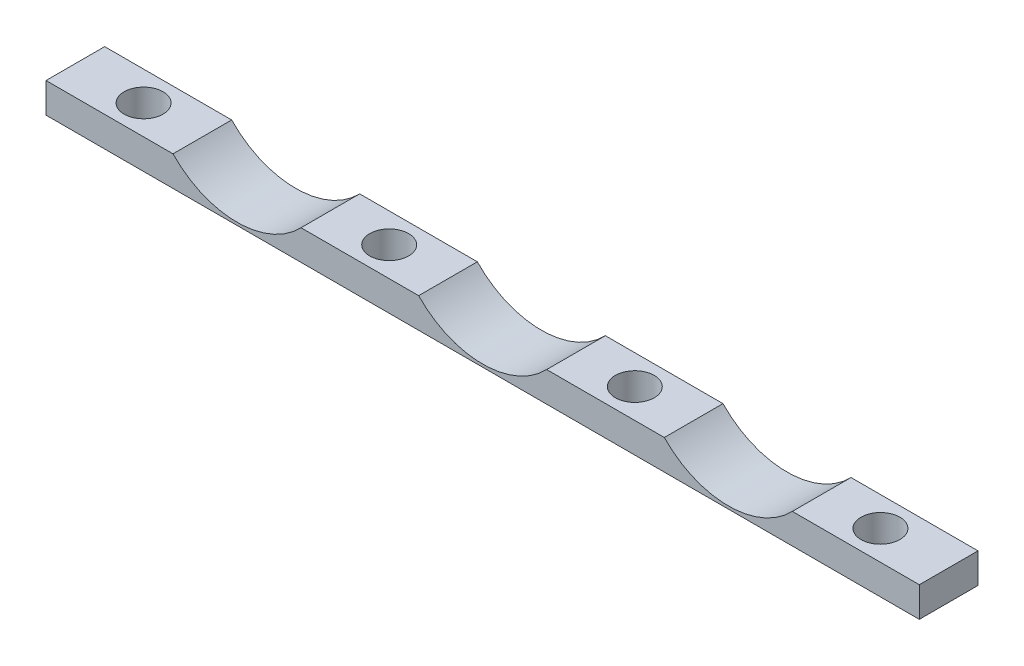
ISO-10303-21;
HEADER;
FILE_DESCRIPTION(('STEP AP214'),'2;1');
FILE_NAME('part.step','',(''),(''),'','','');
FILE_SCHEMA(('AUTOMOTIVE_DESIGN { 1 0 10303 214 1 1 1 1 }'));
ENDSEC;
DATA;
#1=APPLICATION_CONTEXT('core data for automotive mechanical design processes');
#2=APPLICATION_PROTOCOL_DEFINITION('international standard','automotive_design',2000,#1);
#3=PRODUCT_CONTEXT('',#1,'mechanical');
#4=PRODUCT('Part','Part','',(#3));
#5=PRODUCT_RELATED_PRODUCT_CATEGORY('part','',(#4));
#6=PRODUCT_DEFINITION_FORMATION('','',#4);
#7=PRODUCT_DEFINITION_CONTEXT('part definition',#1,'design');
#8=PRODUCT_DEFINITION('design','',#6,#7);
#9=PRODUCT_DEFINITION_SHAPE('','',#8);
#10=(LENGTH_UNIT() NAMED_UNIT(*) SI_UNIT(.MILLI.,.METRE.));
#11=(NAMED_UNIT(*) PLANE_ANGLE_UNIT() SI_UNIT($,.RADIAN.));
#12=(NAMED_UNIT(*) SI_UNIT($,.STERADIAN.) SOLID_ANGLE_UNIT());
#13=UNCERTAINTY_MEASURE_WITH_UNIT(LENGTH_MEASURE(1.E-05),#10,'distance_accuracy_value','');
#14=(GEOMETRIC_REPRESENTATION_CONTEXT(3) GLOBAL_UNCERTAINTY_ASSIGNED_CONTEXT((#13)) GLOBAL_UNIT_ASSIGNED_CONTEXT((#10,
#11,#12)) REPRESENTATION_CONTEXT('',''));
#15=CARTESIAN_POINT('',(0.,0.,0.));
#16=DIRECTION('',(0.,0.,1.));
#17=DIRECTION('',(1.,0.,0.));
#18=AXIS2_PLACEMENT_3D('',#15,#16,#17);
#19=CARTESIAN_POINT('',(-18.0027546578401,-6.,4.3));
#20=DIRECTION('',(0.,0.,-1.));
#21=DIRECTION('',(-1.,0.,0.));
#22=AXIS2_PLACEMENT_3D('',#19,#20,#21);
#23=CYLINDRICAL_SURFACE('',#22,6.5);
#24=CARTESIAN_POINT('',(-18.0027546578401,-6.,0.));
#25=DIRECTION('',(0.,0.,-1.));
#26=DIRECTION('',(1.,0.,0.));
#27=AXIS2_PLACEMENT_3D('',#24,#25,#26);
#28=CIRCLE('',#27,6.5);
#29=CARTESIAN_POINT('',(-13.3123388980167,-10.5,0.));
#30=VERTEX_POINT('',#29);
#31=CARTESIAN_POINT('',(-22.6931704176636,-10.5,0.));
#32=VERTEX_POINT('',#31);
#33=EDGE_CURVE('E144',#30,#32,#28,.T.);
#34=ORIENTED_EDGE('',*,*,#33,.T.);
#35=DIRECTION('',(0.,0.,-1.));
#36=VECTOR('',#35,1.);
#37=CARTESIAN_POINT('',(-22.6931704176636,-10.5,4.3));
#38=LINE('',#37,#36);
#39=CARTESIAN_POINT('',(-22.6931704176636,-10.5,4.3));
#40=VERTEX_POINT('',#39);
#41=EDGE_CURVE('E11',#40,#32,#38,.T.);
#42=ORIENTED_EDGE('',*,*,#41,.F.);
#43=CARTESIAN_POINT('',(-18.0027546578401,-6.,4.3));
#44=DIRECTION('',(0.,0.,-1.));
#45=DIRECTION('',(1.,0.,0.));
#46=AXIS2_PLACEMENT_3D('',#43,#44,#45);
#47=CIRCLE('',#46,6.5);
#48=CARTESIAN_POINT('',(-13.3123388980167,-10.5,4.3));
#49=VERTEX_POINT('',#48);
#50=EDGE_CURVE('E163',#49,#40,#47,.T.);
#51=ORIENTED_EDGE('',*,*,#50,.F.);
#52=DIRECTION('',(0.,0.,-1.));
#53=VECTOR('',#52,1.);
#54=CARTESIAN_POINT('',(-13.3123388980167,-10.5,4.3));
#55=LINE('',#54,#53);
#56=EDGE_CURVE('E140',#49,#30,#55,.T.);
#57=ORIENTED_EDGE('',*,*,#56,.T.);
#58=EDGE_LOOP('',(#34,#42,#51,#57));
#59=FACE_BOUND('',#58,.T.);
#60=ADVANCED_FACE('F36',(#59),#23,.F.);
#61=CARTESIAN_POINT('',(-22.6931704176636,-10.5,4.3));
#62=DIRECTION('',(0.,-1.,0.));
#63=DIRECTION('',(1.,0.,0.));
#64=AXIS2_PLACEMENT_3D('',#61,#62,#63);
#65=PLANE('',#64);
#66=CARTESIAN_POINT('',(-27.,-10.5,2.15));
#67=DIRECTION('',(0.,1.,0.));
#68=DIRECTION('',(-1.,0.,0.));
#69=AXIS2_PLACEMENT_3D('',#66,#67,#68);
#70=CIRCLE('',#69,1.425);
#71=CARTESIAN_POINT('',(-28.425,-10.5,2.15));
#72=VERTEX_POINT('',#71);
#73=EDGE_CURVE('E222',#72,#72,#70,.T.);
#74=ORIENTED_EDGE('',*,*,#73,.F.);
#75=EDGE_LOOP('',(#74));
#76=FACE_BOUND('',#75,.T.);
#77=DIRECTION('',(-1.,0.,0.));
#78=VECTOR('',#77,1.);
#79=CARTESIAN_POINT('',(-22.6931704176636,-10.5,0.));
#80=LINE('',#79,#78);
#81=CARTESIAN_POINT('',(-32.,-10.5,0.));
#82=VERTEX_POINT('',#81);
#83=EDGE_CURVE('E147',#32,#82,#80,.T.);
#84=ORIENTED_EDGE('',*,*,#83,.T.);
#85=DIRECTION('',(0.,0.,-1.));
#86=VECTOR('',#85,1.);
#87=CARTESIAN_POINT('',(-32.,-10.5,4.3));
#88=LINE('',#87,#86);
#89=CARTESIAN_POINT('',(-32.,-10.5,4.3));
#90=VERTEX_POINT('',#89);
#91=EDGE_CURVE('E44',#90,#82,#88,.T.);
#92=ORIENTED_EDGE('',*,*,#91,.F.);
#93=DIRECTION('',(-1.,0.,0.));
#94=VECTOR('',#93,1.);
#95=CARTESIAN_POINT('',(-22.6931704176636,-10.5,4.3));
#96=LINE('',#95,#94);
#97=EDGE_CURVE('E101',#40,#90,#96,.T.);
#98=ORIENTED_EDGE('',*,*,#97,.F.);
#99=ORIENTED_EDGE('',*,*,#41,.T.);
#100=EDGE_LOOP('',(#84,#92,#98,#99));
#101=FACE_BOUND('',#100,.T.);
#102=ADVANCED_FACE('F257',(#76,#101),#65,.F.);
#103=CARTESIAN_POINT('',(-32.,-10.5,4.3));
#104=DIRECTION('',(1.,0.,0.));
#105=DIRECTION('',(0.,0.,-1.));
#106=AXIS2_PLACEMENT_3D('',#103,#104,#105);
#107=PLANE('',#106);
#108=DIRECTION('',(0.,-1.,0.));
#109=VECTOR('',#108,1.);
#110=CARTESIAN_POINT('',(-32.,-10.5,0.));
#111=LINE('',#110,#109);
#112=CARTESIAN_POINT('',(-32.,-12.7,0.));
#113=VERTEX_POINT('',#112);
#114=EDGE_CURVE('E150',#82,#113,#111,.T.);
#115=ORIENTED_EDGE('',*,*,#114,.T.);
#116=DIRECTION('',(0.,0.,-1.));
#117=VECTOR('',#116,1.);
#118=CARTESIAN_POINT('',(-32.,-12.7,4.3));
#119=LINE('',#118,#117);
#120=CARTESIAN_POINT('',(-32.,-12.7,4.3));
#121=VERTEX_POINT('',#120);
#122=EDGE_CURVE('E176',#121,#113,#119,.T.);
#123=ORIENTED_EDGE('',*,*,#122,.F.);
#124=DIRECTION('',(0.,-1.,0.));
#125=VECTOR('',#124,1.);
#126=CARTESIAN_POINT('',(-32.,-10.5,4.3));
#127=LINE('',#126,#125);
#128=EDGE_CURVE('E184',#90,#121,#127,.T.);
#129=ORIENTED_EDGE('',*,*,#128,.F.);
#130=ORIENTED_EDGE('',*,*,#91,.T.);
#131=EDGE_LOOP('',(#115,#123,#129,#130));
#132=FACE_BOUND('',#131,.T.);
#133=ADVANCED_FACE('F182',(#132),#107,.F.);
#134=CARTESIAN_POINT('',(-32.,-12.7,4.3));
#135=DIRECTION('',(0.,1.,0.));
#136=DIRECTION('',(0.,0.,1.));
#137=AXIS2_PLACEMENT_3D('',#134,#135,#136);
#138=PLANE('',#137);
#139=CARTESIAN_POINT('',(27.,-12.7,2.15));
#140=DIRECTION('',(0.,1.,0.));
#141=DIRECTION('',(-1.,0.,0.));
#142=AXIS2_PLACEMENT_3D('',#139,#140,#141);
#143=CIRCLE('',#142,1.425);
#144=CARTESIAN_POINT('',(25.575,-12.7,2.15));
#145=VERTEX_POINT('',#144);
#146=EDGE_CURVE('E219',#145,#145,#143,.T.);
#147=ORIENTED_EDGE('',*,*,#146,.T.);
#148=EDGE_LOOP('',(#147));
#149=FACE_BOUND('',#148,.T.);
#150=CARTESIAN_POINT('',(-27.,-12.7,2.15));
#151=DIRECTION('',(0.,1.,0.));
#152=DIRECTION('',(-1.,0.,0.));
#153=AXIS2_PLACEMENT_3D('',#150,#151,#152);
#154=CIRCLE('',#153,1.425);
#155=CARTESIAN_POINT('',(-28.425,-12.7,2.15));
#156=VERTEX_POINT('',#155);
#157=EDGE_CURVE('E225',#156,#156,#154,.T.);
#158=ORIENTED_EDGE('',*,*,#157,.T.);
#159=EDGE_LOOP('',(#158));
#160=FACE_BOUND('',#159,.T.);
#161=CARTESIAN_POINT('',(9.,-12.7,2.15));
#162=DIRECTION('',(0.,1.,0.));
#163=DIRECTION('',(-1.,0.,0.));
#164=AXIS2_PLACEMENT_3D('',#161,#162,#163);
#165=CIRCLE('',#164,1.425);
#166=CARTESIAN_POINT('',(7.575,-12.7,2.15));
#167=VERTEX_POINT('',#166);
#168=EDGE_CURVE('E213',#167,#167,#165,.T.);
#169=ORIENTED_EDGE('',*,*,#168,.T.);
#170=EDGE_LOOP('',(#169));
#171=FACE_BOUND('',#170,.T.);
#172=CARTESIAN_POINT('',(-9.,-12.7,2.15));
#173=DIRECTION('',(0.,1.,0.));
#174=DIRECTION('',(-1.,0.,0.));
#175=AXIS2_PLACEMENT_3D('',#172,#173,#174);
#176=CIRCLE('',#175,1.425);
#177=CARTESIAN_POINT('',(-10.425,-12.7,2.15));
#178=VERTEX_POINT('',#177);
#179=EDGE_CURVE('E148',#178,#178,#176,.T.);
#180=ORIENTED_EDGE('',*,*,#179,.T.);
#181=EDGE_LOOP('',(#180));
#182=FACE_BOUND('',#181,.T.);
#183=DIRECTION('',(1.,0.,0.));
#184=VECTOR('',#183,1.);
#185=CARTESIAN_POINT('',(-32.,-12.7,0.));
#186=LINE('',#185,#184);
#187=CARTESIAN_POINT('',(32.,-12.7,0.));
#188=VERTEX_POINT('',#187);
#189=EDGE_CURVE('E152',#113,#188,#186,.T.);
#190=ORIENTED_EDGE('',*,*,#189,.T.);
#191=DIRECTION('',(0.,0.,-1.));
#192=VECTOR('',#191,1.);
#193=CARTESIAN_POINT('',(32.,-12.7,4.3));
#194=LINE('',#193,#192);
#195=CARTESIAN_POINT('',(32.,-12.7,4.3));
#196=VERTEX_POINT('',#195);
#197=EDGE_CURVE('E173',#196,#188,#194,.T.);
#198=ORIENTED_EDGE('',*,*,#197,.F.);
#199=DIRECTION('',(1.,0.,0.));
#200=VECTOR('',#199,1.);
#201=CARTESIAN_POINT('',(-32.,-12.7,4.3));
#202=LINE('',#201,#200);
#203=EDGE_CURVE('E202',#121,#196,#202,.T.);
#204=ORIENTED_EDGE('',*,*,#203,.F.);
#205=ORIENTED_EDGE('',*,*,#122,.T.);
#206=EDGE_LOOP('',(#190,#198,#204,#205));
#207=FACE_BOUND('',#206,.T.);
#208=ADVANCED_FACE('F193',(#149,#160,#171,#182,#207),#138,.F.);
#209=CARTESIAN_POINT('',(32.,-10.5,4.3));
#210=DIRECTION('',(-1.,0.,0.));
#211=DIRECTION('',(0.,0.,1.));
#212=AXIS2_PLACEMENT_3D('',#209,#210,#211);
#213=PLANE('',#212);
#214=DIRECTION('',(0.,1.,0.));
#215=VECTOR('',#214,1.);
#216=CARTESIAN_POINT('',(32.,-10.5,0.));
#217=LINE('',#216,#215);
#218=CARTESIAN_POINT('',(32.,-10.5,0.));
#219=VERTEX_POINT('',#218);
#220=EDGE_CURVE('E154',#188,#219,#217,.T.);
#221=ORIENTED_EDGE('',*,*,#220,.T.);
#222=DIRECTION('',(0.,0.,-1.));
#223=VECTOR('',#222,1.);
#224=CARTESIAN_POINT('',(32.,-10.5,4.3));
#225=LINE('',#224,#223);
#226=CARTESIAN_POINT('',(32.,-10.5,4.3));
#227=VERTEX_POINT('',#226);
#228=EDGE_CURVE('E170',#227,#219,#225,.T.);
#229=ORIENTED_EDGE('',*,*,#228,.F.);
#230=DIRECTION('',(0.,1.,0.));
#231=VECTOR('',#230,1.);
#232=CARTESIAN_POINT('',(32.,-10.5,4.3));
#233=LINE('',#232,#231);
#234=EDGE_CURVE('E199',#196,#227,#233,.T.);
#235=ORIENTED_EDGE('',*,*,#234,.F.);
#236=ORIENTED_EDGE('',*,*,#197,.T.);
#237=EDGE_LOOP('',(#221,#229,#235,#236));
#238=FACE_BOUND('',#237,.T.);
#239=ADVANCED_FACE('F197',(#238),#213,.F.);
#240=CARTESIAN_POINT('',(22.6931704176636,-10.5,4.3));
#241=DIRECTION('',(0.,-1.,0.));
#242=DIRECTION('',(0.,0.,-1.));
#243=AXIS2_PLACEMENT_3D('',#240,#241,#242);
#244=PLANE('',#243);
#245=CARTESIAN_POINT('',(27.,-10.5,2.15));
#246=DIRECTION('',(0.,1.,0.));
#247=DIRECTION('',(-1.,0.,0.));
#248=AXIS2_PLACEMENT_3D('',#245,#246,#247);
#249=CIRCLE('',#248,1.425);
#250=CARTESIAN_POINT('',(25.575,-10.5,2.15));
#251=VERTEX_POINT('',#250);
#252=EDGE_CURVE('E216',#251,#251,#249,.T.);
#253=ORIENTED_EDGE('',*,*,#252,.F.);
#254=EDGE_LOOP('',(#253));
#255=FACE_BOUND('',#254,.T.);
#256=DIRECTION('',(-1.,0.,0.));
#257=VECTOR('',#256,1.);
#258=CARTESIAN_POINT('',(22.6931704176636,-10.5,0.));
#259=LINE('',#258,#257);
#260=CARTESIAN_POINT('',(22.6931704176635,-10.5,0.));
#261=VERTEX_POINT('',#260);
#262=EDGE_CURVE('E156',#219,#261,#259,.T.);
#263=ORIENTED_EDGE('',*,*,#262,.T.);
#264=DIRECTION('',(0.,0.,-1.));
#265=VECTOR('',#264,1.);
#266=CARTESIAN_POINT('',(22.6931704176635,-10.5,4.3));
#267=LINE('',#266,#265);
#268=CARTESIAN_POINT('',(22.6931704176635,-10.5,4.3));
#269=VERTEX_POINT('',#268);
#270=EDGE_CURVE('E167',#269,#261,#267,.T.);
#271=ORIENTED_EDGE('',*,*,#270,.F.);
#272=DIRECTION('',(-1.,0.,0.));
#273=VECTOR('',#272,1.);
#274=CARTESIAN_POINT('',(22.6931704176636,-10.5,4.3));
#275=LINE('',#274,#273);
#276=EDGE_CURVE('E201',#227,#269,#275,.T.);
#277=ORIENTED_EDGE('',*,*,#276,.F.);
#278=ORIENTED_EDGE('',*,*,#228,.T.);
#279=EDGE_LOOP('',(#263,#271,#277,#278));
#280=FACE_BOUND('',#279,.T.);
#281=ADVANCED_FACE('F253',(#255,#280),#244,.F.);
#282=CARTESIAN_POINT('',(18.0027546578401,-5.99999999999997,4.3));
#283=DIRECTION('',(0.,0.,-1.));
#284=DIRECTION('',(-1.,0.,0.));
#285=AXIS2_PLACEMENT_3D('',#282,#283,#284);
#286=CYLINDRICAL_SURFACE('',#285,6.50000000000001);
#287=CARTESIAN_POINT('',(18.0027546578401,-5.99999999999997,0.));
#288=DIRECTION('',(0.,0.,-1.));
#289=DIRECTION('',(1.,0.,0.));
#290=AXIS2_PLACEMENT_3D('',#287,#288,#289);
#291=CIRCLE('',#290,6.50000000000001);
#292=CARTESIAN_POINT('',(13.3123388980167,-10.5,0.));
#293=VERTEX_POINT('',#292);
#294=EDGE_CURVE('E158',#261,#293,#291,.T.);
#295=ORIENTED_EDGE('',*,*,#294,.T.);
#296=DIRECTION('',(0.,0.,-1.));
#297=VECTOR('',#296,1.);
#298=CARTESIAN_POINT('',(13.3123388980167,-10.5,4.3));
#299=LINE('',#298,#297);
#300=CARTESIAN_POINT('',(13.3123388980167,-10.5,4.3));
#301=VERTEX_POINT('',#300);
#302=EDGE_CURVE('E135',#301,#293,#299,.T.);
#303=ORIENTED_EDGE('',*,*,#302,.F.);
#304=CARTESIAN_POINT('',(18.0027546578401,-5.99999999999997,4.3));
#305=DIRECTION('',(0.,0.,-1.));
#306=DIRECTION('',(1.,0.,0.));
#307=AXIS2_PLACEMENT_3D('',#304,#305,#306);
#308=CIRCLE('',#307,6.50000000000001);
#309=EDGE_CURVE('E126',#269,#301,#308,.T.);
#310=ORIENTED_EDGE('',*,*,#309,.F.);
#311=ORIENTED_EDGE('',*,*,#270,.T.);
#312=EDGE_LOOP('',(#295,#303,#310,#311));
#313=FACE_BOUND('',#312,.T.);
#314=ADVANCED_FACE('F245',(#313),#286,.F.);
#315=CARTESIAN_POINT('',(4.69041575982343,-10.5,4.3));
#316=DIRECTION('',(0.,-1.,0.));
#317=DIRECTION('',(1.,0.,0.));
#318=AXIS2_PLACEMENT_3D('',#315,#316,#317);
#319=PLANE('',#318);
#320=CARTESIAN_POINT('',(9.,-10.5,2.15));
#321=DIRECTION('',(0.,1.,0.));
#322=DIRECTION('',(-1.,0.,0.));
#323=AXIS2_PLACEMENT_3D('',#320,#321,#322);
#324=CIRCLE('',#323,1.425);
#325=CARTESIAN_POINT('',(7.575,-10.5,2.15));
#326=VERTEX_POINT('',#325);
#327=EDGE_CURVE('E228',#326,#326,#324,.T.);
#328=ORIENTED_EDGE('',*,*,#327,.F.);
#329=EDGE_LOOP('',(#328));
#330=FACE_BOUND('',#329,.T.);
#331=DIRECTION('',(-1.,0.,0.));
#332=VECTOR('',#331,1.);
#333=CARTESIAN_POINT('',(4.69041575982343,-10.5,0.));
#334=LINE('',#333,#332);
#335=CARTESIAN_POINT('',(4.69041575982343,-10.5,0.));
#336=VERTEX_POINT('',#335);
#337=EDGE_CURVE('E134',#293,#336,#334,.T.);
#338=ORIENTED_EDGE('',*,*,#337,.T.);
#339=DIRECTION('',(0.,0.,-1.));
#340=VECTOR('',#339,1.);
#341=CARTESIAN_POINT('',(4.69041575982343,-10.5,4.3));
#342=LINE('',#341,#340);
#343=CARTESIAN_POINT('',(4.69041575982343,-10.5,4.3));
#344=VERTEX_POINT('',#343);
#345=EDGE_CURVE('E131',#344,#336,#342,.T.);
#346=ORIENTED_EDGE('',*,*,#345,.F.);
#347=DIRECTION('',(-1.,0.,0.));
#348=VECTOR('',#347,1.);
#349=CARTESIAN_POINT('',(4.69041575982343,-10.5,4.3));
#350=LINE('',#349,#348);
#351=EDGE_CURVE('E120',#301,#344,#350,.T.);
#352=ORIENTED_EDGE('',*,*,#351,.F.);
#353=ORIENTED_EDGE('',*,*,#302,.T.);
#354=EDGE_LOOP('',(#338,#346,#352,#353));
#355=FACE_BOUND('',#354,.T.);
#356=ADVANCED_FACE('F132',(#330,#355),#319,.F.);
#357=CARTESIAN_POINT('',(0.,-5.99999999999999,4.3));
#358=DIRECTION('',(0.,0.,-1.));
#359=DIRECTION('',(-1.,0.,0.));
#360=AXIS2_PLACEMENT_3D('',#357,#358,#359);
#361=CYLINDRICAL_SURFACE('',#360,6.50000000000001);
#362=CARTESIAN_POINT('',(0.,-5.99999999999999,0.));
#363=DIRECTION('',(0.,0.,-1.));
#364=DIRECTION('',(1.,0.,0.));
#365=AXIS2_PLACEMENT_3D('',#362,#363,#364);
#366=CIRCLE('',#365,6.50000000000001);
#367=CARTESIAN_POINT('',(-4.69041575982343,-10.5,0.));
#368=VERTEX_POINT('',#367);
#369=EDGE_CURVE('E87',#336,#368,#366,.T.);
#370=ORIENTED_EDGE('',*,*,#369,.T.);
#371=DIRECTION('',(0.,0.,-1.));
#372=VECTOR('',#371,1.);
#373=CARTESIAN_POINT('',(-4.69041575982343,-10.5,4.3));
#374=LINE('',#373,#372);
#375=CARTESIAN_POINT('',(-4.69041575982343,-10.5,4.3));
#376=VERTEX_POINT('',#375);
#377=EDGE_CURVE('E136',#376,#368,#374,.T.);
#378=ORIENTED_EDGE('',*,*,#377,.F.);
#379=CARTESIAN_POINT('',(0.,-5.99999999999999,4.3));
#380=DIRECTION('',(0.,0.,-1.));
#381=DIRECTION('',(1.,0.,0.));
#382=AXIS2_PLACEMENT_3D('',#379,#380,#381);
#383=CIRCLE('',#382,6.50000000000001);
#384=EDGE_CURVE('E124',#344,#376,#383,.T.);
#385=ORIENTED_EDGE('',*,*,#384,.F.);
#386=ORIENTED_EDGE('',*,*,#345,.T.);
#387=EDGE_LOOP('',(#370,#378,#385,#386));
#388=FACE_BOUND('',#387,.T.);
#389=ADVANCED_FACE('F138',(#388),#361,.F.);
#390=CARTESIAN_POINT('',(-13.3123388980167,-10.5,4.3));
#391=DIRECTION('',(0.,-1.,0.));
#392=DIRECTION('',(0.,0.,-1.));
#393=AXIS2_PLACEMENT_3D('',#390,#391,#392);
#394=PLANE('',#393);
#395=CARTESIAN_POINT('',(-9.,-10.5,2.15));
#396=DIRECTION('',(0.,1.,0.));
#397=DIRECTION('',(-1.,0.,0.));
#398=AXIS2_PLACEMENT_3D('',#395,#396,#397);
#399=CIRCLE('',#398,1.425);
#400=CARTESIAN_POINT('',(-10.425,-10.5,2.15));
#401=VERTEX_POINT('',#400);
#402=EDGE_CURVE('E210',#401,#401,#399,.T.);
#403=ORIENTED_EDGE('',*,*,#402,.F.);
#404=EDGE_LOOP('',(#403));
#405=FACE_BOUND('',#404,.T.);
#406=DIRECTION('',(-1.,0.,0.));
#407=VECTOR('',#406,1.);
#408=CARTESIAN_POINT('',(-13.3123388980167,-10.5,0.));
#409=LINE('',#408,#407);
#410=EDGE_CURVE('E93',#368,#30,#409,.T.);
#411=ORIENTED_EDGE('',*,*,#410,.T.);
#412=ORIENTED_EDGE('',*,*,#56,.F.);
#413=DIRECTION('',(-1.,0.,0.));
#414=VECTOR('',#413,1.);
#415=CARTESIAN_POINT('',(-13.3123388980167,-10.5,4.3));
#416=LINE('',#415,#414);
#417=EDGE_CURVE('E52',#376,#49,#416,.T.);
#418=ORIENTED_EDGE('',*,*,#417,.F.);
#419=ORIENTED_EDGE('',*,*,#377,.T.);
#420=EDGE_LOOP('',(#411,#412,#418,#419));
#421=FACE_BOUND('',#420,.T.);
#422=ADVANCED_FACE('F251',(#405,#421),#394,.F.);
#423=CARTESIAN_POINT('',(-18.0027546578401,-6.,4.3));
#424=DIRECTION('',(0.,0.,1.));
#425=DIRECTION('',(1.,0.,0.));
#426=AXIS2_PLACEMENT_3D('',#423,#424,#425);
#427=PLANE('',#426);
#428=ORIENTED_EDGE('',*,*,#50,.T.);
#429=ORIENTED_EDGE('',*,*,#97,.T.);
#430=ORIENTED_EDGE('',*,*,#128,.T.);
#431=ORIENTED_EDGE('',*,*,#203,.T.);
#432=ORIENTED_EDGE('',*,*,#234,.T.);
#433=ORIENTED_EDGE('',*,*,#276,.T.);
#434=ORIENTED_EDGE('',*,*,#309,.T.);
#435=ORIENTED_EDGE('',*,*,#351,.T.);
#436=ORIENTED_EDGE('',*,*,#384,.T.);
#437=ORIENTED_EDGE('',*,*,#417,.T.);
#438=EDGE_LOOP('',(#428,#429,#430,#431,#432,#433,#434,#435,#436,#437));
#439=FACE_BOUND('',#438,.T.);
#440=ADVANCED_FACE('F122',(#439),#427,.T.);
#441=CARTESIAN_POINT('',(-18.0027546578401,-6.,0.));
#442=DIRECTION('',(0.,0.,1.));
#443=DIRECTION('',(1.,0.,0.));
#444=AXIS2_PLACEMENT_3D('',#441,#442,#443);
#445=PLANE('',#444);
#446=ORIENTED_EDGE('',*,*,#33,.F.);
#447=ORIENTED_EDGE('',*,*,#410,.F.);
#448=ORIENTED_EDGE('',*,*,#369,.F.);
#449=ORIENTED_EDGE('',*,*,#337,.F.);
#450=ORIENTED_EDGE('',*,*,#294,.F.);
#451=ORIENTED_EDGE('',*,*,#262,.F.);
#452=ORIENTED_EDGE('',*,*,#220,.F.);
#453=ORIENTED_EDGE('',*,*,#189,.F.);
#454=ORIENTED_EDGE('',*,*,#114,.F.);
#455=ORIENTED_EDGE('',*,*,#83,.F.);
#456=EDGE_LOOP('',(#446,#447,#448,#449,#450,#451,#452,#453,#454,#455));
#457=FACE_BOUND('',#456,.T.);
#458=ADVANCED_FACE('F188',(#457),#445,.F.);
#459=CARTESIAN_POINT('',(-9.,-12.7,2.15));
#460=DIRECTION('',(0.,1.,0.));
#461=DIRECTION('',(-1.,0.,0.));
#462=AXIS2_PLACEMENT_3D('',#459,#460,#461);
#463=CYLINDRICAL_SURFACE('',#462,1.425);
#464=CARTESIAN_POINT('',(-10.425,-12.7,2.15));
#465=CARTESIAN_POINT('',(-10.425,-12.6770833333333,2.15));
#466=CARTESIAN_POINT('',(-10.425,-12.6541666666667,2.15));
#467=CARTESIAN_POINT('',(-10.425,-12.6083333333333,2.15));
#468=CARTESIAN_POINT('',(-10.425,-12.5854166666667,2.15));
#469=CARTESIAN_POINT('',(-10.425,-12.5395833333333,2.15));
#470=CARTESIAN_POINT('',(-10.425,-12.5166666666667,2.15));
#471=CARTESIAN_POINT('',(-10.425,-12.4708333333333,2.15));
#472=CARTESIAN_POINT('',(-10.425,-12.4479166666667,2.15));
#473=CARTESIAN_POINT('',(-10.425,-12.4020833333333,2.15));
#474=CARTESIAN_POINT('',(-10.425,-12.3791666666667,2.15));
#475=CARTESIAN_POINT('',(-10.425,-12.3333333333333,2.15));
#476=CARTESIAN_POINT('',(-10.425,-12.3104166666667,2.15));
#477=CARTESIAN_POINT('',(-10.425,-12.2645833333333,2.15));
#478=CARTESIAN_POINT('',(-10.425,-12.2416666666667,2.15));
#479=CARTESIAN_POINT('',(-10.425,-12.1958333333333,2.15));
#480=CARTESIAN_POINT('',(-10.425,-12.1729166666667,2.15));
#481=CARTESIAN_POINT('',(-10.425,-12.1270833333333,2.15));
#482=CARTESIAN_POINT('',(-10.425,-12.1041666666667,2.15));
#483=CARTESIAN_POINT('',(-10.425,-12.0583333333333,2.15));
#484=CARTESIAN_POINT('',(-10.425,-12.0354166666667,2.15));
#485=CARTESIAN_POINT('',(-10.425,-11.9895833333333,2.15));
#486=CARTESIAN_POINT('',(-10.425,-11.9666666666667,2.15));
#487=CARTESIAN_POINT('',(-10.425,-11.9208333333333,2.15));
#488=CARTESIAN_POINT('',(-10.425,-11.8979166666667,2.15));
#489=CARTESIAN_POINT('',(-10.425,-11.8520833333333,2.15));
#490=CARTESIAN_POINT('',(-10.425,-11.8291666666667,2.15));
#491=CARTESIAN_POINT('',(-10.425,-11.7833333333333,2.15));
#492=CARTESIAN_POINT('',(-10.425,-11.7604166666667,2.15));
#493=CARTESIAN_POINT('',(-10.425,-11.7145833333333,2.15));
#494=CARTESIAN_POINT('',(-10.425,-11.6916666666667,2.15));
#495=CARTESIAN_POINT('',(-10.425,-11.6458333333333,2.15));
#496=CARTESIAN_POINT('',(-10.425,-11.6229166666667,2.15));
#497=CARTESIAN_POINT('',(-10.425,-11.5770833333333,2.15));
#498=CARTESIAN_POINT('',(-10.425,-11.5541666666667,2.15));
#499=CARTESIAN_POINT('',(-10.425,-11.5083333333333,2.15));
#500=CARTESIAN_POINT('',(-10.425,-11.4854166666667,2.15));
#501=CARTESIAN_POINT('',(-10.425,-11.4395833333333,2.15));
#502=CARTESIAN_POINT('',(-10.425,-11.4166666666667,2.15));
#503=CARTESIAN_POINT('',(-10.425,-11.3708333333333,2.15));
#504=CARTESIAN_POINT('',(-10.425,-11.3479166666667,2.15));
#505=CARTESIAN_POINT('',(-10.425,-11.3020833333333,2.15));
#506=CARTESIAN_POINT('',(-10.425,-11.2791666666667,2.15));
#507=CARTESIAN_POINT('',(-10.425,-11.2333333333333,2.15));
#508=CARTESIAN_POINT('',(-10.425,-11.2104166666667,2.15));
#509=CARTESIAN_POINT('',(-10.425,-11.1645833333333,2.15));
#510=CARTESIAN_POINT('',(-10.425,-11.1416666666667,2.15));
#511=CARTESIAN_POINT('',(-10.425,-11.0958333333333,2.15));
#512=CARTESIAN_POINT('',(-10.425,-11.0729166666667,2.15));
#513=CARTESIAN_POINT('',(-10.425,-11.0270833333333,2.15));
#514=CARTESIAN_POINT('',(-10.425,-11.0041666666667,2.15));
#515=CARTESIAN_POINT('',(-10.425,-10.9583333333333,2.15));
#516=CARTESIAN_POINT('',(-10.425,-10.9354166666667,2.15));
#517=CARTESIAN_POINT('',(-10.425,-10.8895833333333,2.15));
#518=CARTESIAN_POINT('',(-10.425,-10.8666666666667,2.15));
#519=CARTESIAN_POINT('',(-10.425,-10.8208333333333,2.15));
#520=CARTESIAN_POINT('',(-10.425,-10.7979166666667,2.15));
#521=CARTESIAN_POINT('',(-10.425,-10.7520833333333,2.15));
#522=CARTESIAN_POINT('',(-10.425,-10.7291666666667,2.15));
#523=CARTESIAN_POINT('',(-10.425,-10.6833333333333,2.15));
#524=CARTESIAN_POINT('',(-10.425,-10.6604166666667,2.15));
#525=CARTESIAN_POINT('',(-10.425,-10.6145833333333,2.15));
#526=CARTESIAN_POINT('',(-10.425,-10.5916666666667,2.15));
#527=CARTESIAN_POINT('',(-10.425,-10.5458333333333,2.15));
#528=CARTESIAN_POINT('',(-10.425,-10.5229166666667,2.15));
#529=CARTESIAN_POINT('',(-10.425,-10.5,2.15));
#530=B_SPLINE_CURVE_WITH_KNOTS('',3,(#464,#465,#466,#467,#468,#469,#470,#471,#472,#473,#474,
#475,#476,#477,#478,#479,#480,#481,#482,#483,#484,#485,#486,#487,#488,#489,#490,#491,#492,#493,
#494,#495,#496,#497,#498,#499,#500,#501,#502,#503,#504,#505,#506,#507,#508,#509,#510,#511,#512,
#513,#514,#515,#516,#517,#518,#519,#520,#521,#522,#523,#524,#525,#526,#527,#528,#529),
.UNSPECIFIED.,.F.,.F.,(4,2,2,2,2,2,2,2,2,2,2,2,2,2,2,2,2,2,2,2,2,2,2,2,2,2,2,2,2,2,2,2,4),(0.,
0.0687500000000011,0.1375,0.206250000000002,0.275000000000001,0.343750000000002,
0.412500000000001,0.481250000000003,0.550000000000002,0.618750000000001,0.687500000000002,
0.756250000000002,0.825000000000003,0.893750000000002,0.962500000000003,1.03125,1.1,1.16875,
1.2375,1.30625,1.375,1.44375,1.5125,1.58125,1.65,1.71875,1.7875,1.85625000000001,1.925,
1.99375000000001,2.06250000000001,2.13125,2.20000000000001),.UNSPECIFIED.);
#531=EDGE_CURVE('BSEAM240',#178,#401,#530,.T.);
#532=ORIENTED_EDGE('',*,*,#179,.F.);
#533=ORIENTED_EDGE('',*,*,#402,.T.);
#534=ORIENTED_EDGE('',*,*,#531,.T.);
#535=ORIENTED_EDGE('',*,*,#531,.F.);
#536=EDGE_LOOP('',(#532,#534,#533,#535));
#537=FACE_BOUND('',#536,.T.);
#538=ADVANCED_FACE('F240',(#537),#463,.F.);
#539=CARTESIAN_POINT('',(9.,-12.7,2.15));
#540=DIRECTION('',(0.,1.,0.));
#541=DIRECTION('',(-1.,0.,0.));
#542=AXIS2_PLACEMENT_3D('',#539,#540,#541);
#543=CYLINDRICAL_SURFACE('',#542,1.425);
#544=CARTESIAN_POINT('',(7.575,-12.7,2.15));
#545=CARTESIAN_POINT('',(7.575,-12.6770833333333,2.15));
#546=CARTESIAN_POINT('',(7.575,-12.6541666666667,2.15));
#547=CARTESIAN_POINT('',(7.575,-12.6083333333333,2.15));
#548=CARTESIAN_POINT('',(7.575,-12.5854166666667,2.15));
#549=CARTESIAN_POINT('',(7.575,-12.5395833333333,2.15));
#550=CARTESIAN_POINT('',(7.575,-12.5166666666667,2.15));
#551=CARTESIAN_POINT('',(7.575,-12.4708333333333,2.15));
#552=CARTESIAN_POINT('',(7.575,-12.4479166666667,2.15));
#553=CARTESIAN_POINT('',(7.575,-12.4020833333333,2.15));
#554=CARTESIAN_POINT('',(7.575,-12.3791666666667,2.15));
#555=CARTESIAN_POINT('',(7.575,-12.3333333333333,2.15));
#556=CARTESIAN_POINT('',(7.575,-12.3104166666667,2.15));
#557=CARTESIAN_POINT('',(7.575,-12.2645833333333,2.15));
#558=CARTESIAN_POINT('',(7.575,-12.2416666666667,2.15));
#559=CARTESIAN_POINT('',(7.575,-12.1958333333333,2.15));
#560=CARTESIAN_POINT('',(7.575,-12.1729166666667,2.15));
#561=CARTESIAN_POINT('',(7.575,-12.1270833333333,2.15));
#562=CARTESIAN_POINT('',(7.575,-12.1041666666667,2.15));
#563=CARTESIAN_POINT('',(7.575,-12.0583333333333,2.15));
#564=CARTESIAN_POINT('',(7.575,-12.0354166666667,2.15));
#565=CARTESIAN_POINT('',(7.575,-11.9895833333333,2.15));
#566=CARTESIAN_POINT('',(7.575,-11.9666666666667,2.15));
#567=CARTESIAN_POINT('',(7.575,-11.9208333333333,2.15));
#568=CARTESIAN_POINT('',(7.575,-11.8979166666667,2.15));
#569=CARTESIAN_POINT('',(7.575,-11.8520833333333,2.15));
#570=CARTESIAN_POINT('',(7.575,-11.8291666666667,2.15));
#571=CARTESIAN_POINT('',(7.575,-11.7833333333333,2.15));
#572=CARTESIAN_POINT('',(7.575,-11.7604166666667,2.15));
#573=CARTESIAN_POINT('',(7.575,-11.7145833333333,2.15));
#574=CARTESIAN_POINT('',(7.575,-11.6916666666667,2.15));
#575=CARTESIAN_POINT('',(7.575,-11.6458333333333,2.15));
#576=CARTESIAN_POINT('',(7.575,-11.6229166666667,2.15));
#577=CARTESIAN_POINT('',(7.575,-11.5770833333333,2.15));
#578=CARTESIAN_POINT('',(7.575,-11.5541666666667,2.15));
#579=CARTESIAN_POINT('',(7.575,-11.5083333333333,2.15));
#580=CARTESIAN_POINT('',(7.575,-11.4854166666667,2.15));
#581=CARTESIAN_POINT('',(7.575,-11.4395833333333,2.15));
#582=CARTESIAN_POINT('',(7.575,-11.4166666666667,2.15));
#583=CARTESIAN_POINT('',(7.575,-11.3708333333333,2.15));
#584=CARTESIAN_POINT('',(7.575,-11.3479166666667,2.15));
#585=CARTESIAN_POINT('',(7.575,-11.3020833333333,2.15));
#586=CARTESIAN_POINT('',(7.575,-11.2791666666667,2.15));
#587=CARTESIAN_POINT('',(7.575,-11.2333333333333,2.15));
#588=CARTESIAN_POINT('',(7.575,-11.2104166666667,2.15));
#589=CARTESIAN_POINT('',(7.575,-11.1645833333333,2.15));
#590=CARTESIAN_POINT('',(7.575,-11.1416666666667,2.15));
#591=CARTESIAN_POINT('',(7.575,-11.0958333333333,2.15));
#592=CARTESIAN_POINT('',(7.575,-11.0729166666667,2.15));
#593=CARTESIAN_POINT('',(7.575,-11.0270833333333,2.15));
#594=CARTESIAN_POINT('',(7.575,-11.0041666666667,2.15));
#595=CARTESIAN_POINT('',(7.575,-10.9583333333333,2.15));
#596=CARTESIAN_POINT('',(7.575,-10.9354166666667,2.15));
#597=CARTESIAN_POINT('',(7.575,-10.8895833333333,2.15));
#598=CARTESIAN_POINT('',(7.575,-10.8666666666667,2.15));
#599=CARTESIAN_POINT('',(7.575,-10.8208333333333,2.15));
#600=CARTESIAN_POINT('',(7.575,-10.7979166666667,2.15));
#601=CARTESIAN_POINT('',(7.575,-10.7520833333333,2.15));
#602=CARTESIAN_POINT('',(7.575,-10.7291666666667,2.15));
#603=CARTESIAN_POINT('',(7.575,-10.6833333333333,2.15));
#604=CARTESIAN_POINT('',(7.575,-10.6604166666667,2.15));
#605=CARTESIAN_POINT('',(7.575,-10.6145833333333,2.15));
#606=CARTESIAN_POINT('',(7.575,-10.5916666666667,2.15));
#607=CARTESIAN_POINT('',(7.575,-10.5458333333333,2.15));
#608=CARTESIAN_POINT('',(7.575,-10.5229166666667,2.15));
#609=CARTESIAN_POINT('',(7.575,-10.5,2.15));
#610=B_SPLINE_CURVE_WITH_KNOTS('',3,(#544,#545,#546,#547,#548,#549,#550,#551,#552,#553,#554,
#555,#556,#557,#558,#559,#560,#561,#562,#563,#564,#565,#566,#567,#568,#569,#570,#571,#572,#573,
#574,#575,#576,#577,#578,#579,#580,#581,#582,#583,#584,#585,#586,#587,#588,#589,#590,#591,#592,
#593,#594,#595,#596,#597,#598,#599,#600,#601,#602,#603,#604,#605,#606,#607,#608,#609),
.UNSPECIFIED.,.F.,.F.,(4,2,2,2,2,2,2,2,2,2,2,2,2,2,2,2,2,2,2,2,2,2,2,2,2,2,2,2,2,2,2,2,4),(0.,
0.0687500000000011,0.1375,0.206250000000002,0.275000000000001,0.343750000000002,
0.412500000000001,0.481250000000003,0.550000000000002,0.618750000000001,0.687500000000002,
0.756250000000002,0.825000000000003,0.893750000000002,0.962500000000003,1.03125,1.1,1.16875,
1.2375,1.30625,1.375,1.44375,1.5125,1.58125,1.65,1.71875,1.7875,1.85625000000001,1.925,
1.99375000000001,2.06250000000001,2.13125,2.20000000000001),.UNSPECIFIED.);
#611=EDGE_CURVE('BSEAM236',#167,#326,#610,.T.);
#612=ORIENTED_EDGE('',*,*,#168,.F.);
#613=ORIENTED_EDGE('',*,*,#327,.T.);
#614=ORIENTED_EDGE('',*,*,#611,.T.);
#615=ORIENTED_EDGE('',*,*,#611,.F.);
#616=EDGE_LOOP('',(#612,#614,#613,#615));
#617=FACE_BOUND('',#616,.T.);
#618=ADVANCED_FACE('F236',(#617),#543,.F.);
#619=CARTESIAN_POINT('',(27.,-12.7,2.15));
#620=DIRECTION('',(0.,1.,0.));
#621=DIRECTION('',(-1.,0.,0.));
#622=AXIS2_PLACEMENT_3D('',#619,#620,#621);
#623=CYLINDRICAL_SURFACE('',#622,1.425);
#624=CARTESIAN_POINT('',(25.575,-12.7,2.15));
#625=CARTESIAN_POINT('',(25.575,-12.6770833333333,2.15));
#626=CARTESIAN_POINT('',(25.575,-12.6541666666667,2.15));
#627=CARTESIAN_POINT('',(25.575,-12.6083333333333,2.15));
#628=CARTESIAN_POINT('',(25.575,-12.5854166666667,2.15));
#629=CARTESIAN_POINT('',(25.575,-12.5395833333333,2.15));
#630=CARTESIAN_POINT('',(25.575,-12.5166666666667,2.15));
#631=CARTESIAN_POINT('',(25.575,-12.4708333333333,2.15));
#632=CARTESIAN_POINT('',(25.575,-12.4479166666667,2.15));
#633=CARTESIAN_POINT('',(25.575,-12.4020833333333,2.15));
#634=CARTESIAN_POINT('',(25.575,-12.3791666666667,2.15));
#635=CARTESIAN_POINT('',(25.575,-12.3333333333333,2.15));
#636=CARTESIAN_POINT('',(25.575,-12.3104166666667,2.15));
#637=CARTESIAN_POINT('',(25.575,-12.2645833333333,2.15));
#638=CARTESIAN_POINT('',(25.575,-12.2416666666667,2.15));
#639=CARTESIAN_POINT('',(25.575,-12.1958333333333,2.15));
#640=CARTESIAN_POINT('',(25.575,-12.1729166666667,2.15));
#641=CARTESIAN_POINT('',(25.575,-12.1270833333333,2.15));
#642=CARTESIAN_POINT('',(25.575,-12.1041666666667,2.15));
#643=CARTESIAN_POINT('',(25.575,-12.0583333333333,2.15));
#644=CARTESIAN_POINT('',(25.575,-12.0354166666667,2.15));
#645=CARTESIAN_POINT('',(25.575,-11.9895833333333,2.15));
#646=CARTESIAN_POINT('',(25.575,-11.9666666666667,2.15));
#647=CARTESIAN_POINT('',(25.575,-11.9208333333333,2.15));
#648=CARTESIAN_POINT('',(25.575,-11.8979166666667,2.15));
#649=CARTESIAN_POINT('',(25.575,-11.8520833333333,2.15));
#650=CARTESIAN_POINT('',(25.575,-11.8291666666667,2.15));
#651=CARTESIAN_POINT('',(25.575,-11.7833333333333,2.15));
#652=CARTESIAN_POINT('',(25.575,-11.7604166666667,2.15));
#653=CARTESIAN_POINT('',(25.575,-11.7145833333333,2.15));
#654=CARTESIAN_POINT('',(25.575,-11.6916666666667,2.15));
#655=CARTESIAN_POINT('',(25.575,-11.6458333333333,2.15));
#656=CARTESIAN_POINT('',(25.575,-11.6229166666667,2.15));
#657=CARTESIAN_POINT('',(25.575,-11.5770833333333,2.15));
#658=CARTESIAN_POINT('',(25.575,-11.5541666666667,2.15));
#659=CARTESIAN_POINT('',(25.575,-11.5083333333333,2.15));
#660=CARTESIAN_POINT('',(25.575,-11.4854166666667,2.15));
#661=CARTESIAN_POINT('',(25.575,-11.4395833333333,2.15));
#662=CARTESIAN_POINT('',(25.575,-11.4166666666667,2.15));
#663=CARTESIAN_POINT('',(25.575,-11.3708333333333,2.15));
#664=CARTESIAN_POINT('',(25.575,-11.3479166666667,2.15));
#665=CARTESIAN_POINT('',(25.575,-11.3020833333333,2.15));
#666=CARTESIAN_POINT('',(25.575,-11.2791666666667,2.15));
#667=CARTESIAN_POINT('',(25.575,-11.2333333333333,2.15));
#668=CARTESIAN_POINT('',(25.575,-11.2104166666667,2.15));
#669=CARTESIAN_POINT('',(25.575,-11.1645833333333,2.15));
#670=CARTESIAN_POINT('',(25.575,-11.1416666666667,2.15));
#671=CARTESIAN_POINT('',(25.575,-11.0958333333333,2.15));
#672=CARTESIAN_POINT('',(25.575,-11.0729166666667,2.15));
#673=CARTESIAN_POINT('',(25.575,-11.0270833333333,2.15));
#674=CARTESIAN_POINT('',(25.575,-11.0041666666667,2.15));
#675=CARTESIAN_POINT('',(25.575,-10.9583333333333,2.15));
#676=CARTESIAN_POINT('',(25.575,-10.9354166666667,2.15));
#677=CARTESIAN_POINT('',(25.575,-10.8895833333333,2.15));
#678=CARTESIAN_POINT('',(25.575,-10.8666666666667,2.15));
#679=CARTESIAN_POINT('',(25.575,-10.8208333333333,2.15));
#680=CARTESIAN_POINT('',(25.575,-10.7979166666667,2.15));
#681=CARTESIAN_POINT('',(25.575,-10.7520833333333,2.15));
#682=CARTESIAN_POINT('',(25.575,-10.7291666666667,2.15));
#683=CARTESIAN_POINT('',(25.575,-10.6833333333333,2.15));
#684=CARTESIAN_POINT('',(25.575,-10.6604166666667,2.15));
#685=CARTESIAN_POINT('',(25.575,-10.6145833333333,2.15));
#686=CARTESIAN_POINT('',(25.575,-10.5916666666667,2.15));
#687=CARTESIAN_POINT('',(25.575,-10.5458333333333,2.15));
#688=CARTESIAN_POINT('',(25.575,-10.5229166666667,2.15));
#689=CARTESIAN_POINT('',(25.575,-10.5,2.15));
#690=B_SPLINE_CURVE_WITH_KNOTS('',3,(#624,#625,#626,#627,#628,#629,#630,#631,#632,#633,#634,
#635,#636,#637,#638,#639,#640,#641,#642,#643,#644,#645,#646,#647,#648,#649,#650,#651,#652,#653,
#654,#655,#656,#657,#658,#659,#660,#661,#662,#663,#664,#665,#666,#667,#668,#669,#670,#671,#672,
#673,#674,#675,#676,#677,#678,#679,#680,#681,#682,#683,#684,#685,#686,#687,#688,#689),
.UNSPECIFIED.,.F.,.F.,(4,2,2,2,2,2,2,2,2,2,2,2,2,2,2,2,2,2,2,2,2,2,2,2,2,2,2,2,2,2,2,2,4),(0.,
0.0687500000000011,0.1375,0.206250000000002,0.275000000000001,0.343750000000002,
0.412500000000001,0.481250000000003,0.550000000000002,0.618750000000001,0.687500000000002,
0.756250000000002,0.825000000000003,0.893750000000002,0.962500000000003,1.03125,1.1,1.16875,
1.2375,1.30625,1.375,1.44375,1.5125,1.58125,1.65,1.71875,1.7875,1.85625,1.925,1.99375,2.0625,
2.13125,2.2),.UNSPECIFIED.);
#691=EDGE_CURVE('BSEAM239',#145,#251,#690,.T.);
#692=ORIENTED_EDGE('',*,*,#146,.F.);
#693=ORIENTED_EDGE('',*,*,#252,.T.);
#694=ORIENTED_EDGE('',*,*,#691,.T.);
#695=ORIENTED_EDGE('',*,*,#691,.F.);
#696=EDGE_LOOP('',(#692,#694,#693,#695));
#697=FACE_BOUND('',#696,.T.);
#698=ADVANCED_FACE('F239',(#697),#623,.F.);
#699=CARTESIAN_POINT('',(-27.,-12.7,2.15));
#700=DIRECTION('',(0.,1.,0.));
#701=DIRECTION('',(-1.,0.,0.));
#702=AXIS2_PLACEMENT_3D('',#699,#700,#701);
#703=CYLINDRICAL_SURFACE('',#702,1.425);
#704=CARTESIAN_POINT('',(-28.425,-12.7,2.15));
#705=CARTESIAN_POINT('',(-28.425,-12.6770833333333,2.15));
#706=CARTESIAN_POINT('',(-28.425,-12.6541666666667,2.15));
#707=CARTESIAN_POINT('',(-28.425,-12.6083333333333,2.15));
#708=CARTESIAN_POINT('',(-28.425,-12.5854166666667,2.15));
#709=CARTESIAN_POINT('',(-28.425,-12.5395833333333,2.15));
#710=CARTESIAN_POINT('',(-28.425,-12.5166666666667,2.15));
#711=CARTESIAN_POINT('',(-28.425,-12.4708333333333,2.15));
#712=CARTESIAN_POINT('',(-28.425,-12.4479166666667,2.15));
#713=CARTESIAN_POINT('',(-28.425,-12.4020833333333,2.15));
#714=CARTESIAN_POINT('',(-28.425,-12.3791666666667,2.15));
#715=CARTESIAN_POINT('',(-28.425,-12.3333333333333,2.15));
#716=CARTESIAN_POINT('',(-28.425,-12.3104166666667,2.15));
#717=CARTESIAN_POINT('',(-28.425,-12.2645833333333,2.15));
#718=CARTESIAN_POINT('',(-28.425,-12.2416666666667,2.15));
#719=CARTESIAN_POINT('',(-28.425,-12.1958333333333,2.15));
#720=CARTESIAN_POINT('',(-28.425,-12.1729166666667,2.15));
#721=CARTESIAN_POINT('',(-28.425,-12.1270833333333,2.15));
#722=CARTESIAN_POINT('',(-28.425,-12.1041666666667,2.15));
#723=CARTESIAN_POINT('',(-28.425,-12.0583333333333,2.15));
#724=CARTESIAN_POINT('',(-28.425,-12.0354166666667,2.15));
#725=CARTESIAN_POINT('',(-28.425,-11.9895833333333,2.15));
#726=CARTESIAN_POINT('',(-28.425,-11.9666666666667,2.15));
#727=CARTESIAN_POINT('',(-28.425,-11.9208333333333,2.15));
#728=CARTESIAN_POINT('',(-28.425,-11.8979166666667,2.15));
#729=CARTESIAN_POINT('',(-28.425,-11.8520833333333,2.15));
#730=CARTESIAN_POINT('',(-28.425,-11.8291666666667,2.15));
#731=CARTESIAN_POINT('',(-28.425,-11.7833333333333,2.15));
#732=CARTESIAN_POINT('',(-28.425,-11.7604166666667,2.15));
#733=CARTESIAN_POINT('',(-28.425,-11.7145833333333,2.15));
#734=CARTESIAN_POINT('',(-28.425,-11.6916666666667,2.15));
#735=CARTESIAN_POINT('',(-28.425,-11.6458333333333,2.15));
#736=CARTESIAN_POINT('',(-28.425,-11.6229166666667,2.15));
#737=CARTESIAN_POINT('',(-28.425,-11.5770833333333,2.15));
#738=CARTESIAN_POINT('',(-28.425,-11.5541666666667,2.15));
#739=CARTESIAN_POINT('',(-28.425,-11.5083333333333,2.15));
#740=CARTESIAN_POINT('',(-28.425,-11.4854166666667,2.15));
#741=CARTESIAN_POINT('',(-28.425,-11.4395833333333,2.15));
#742=CARTESIAN_POINT('',(-28.425,-11.4166666666667,2.15));
#743=CARTESIAN_POINT('',(-28.425,-11.3708333333333,2.15));
#744=CARTESIAN_POINT('',(-28.425,-11.3479166666667,2.15));
#745=CARTESIAN_POINT('',(-28.425,-11.3020833333333,2.15));
#746=CARTESIAN_POINT('',(-28.425,-11.2791666666667,2.15));
#747=CARTESIAN_POINT('',(-28.425,-11.2333333333333,2.15));
#748=CARTESIAN_POINT('',(-28.425,-11.2104166666667,2.15));
#749=CARTESIAN_POINT('',(-28.425,-11.1645833333333,2.15));
#750=CARTESIAN_POINT('',(-28.425,-11.1416666666667,2.15));
#751=CARTESIAN_POINT('',(-28.425,-11.0958333333333,2.15));
#752=CARTESIAN_POINT('',(-28.425,-11.0729166666667,2.15));
#753=CARTESIAN_POINT('',(-28.425,-11.0270833333333,2.15));
#754=CARTESIAN_POINT('',(-28.425,-11.0041666666667,2.15));
#755=CARTESIAN_POINT('',(-28.425,-10.9583333333333,2.15));
#756=CARTESIAN_POINT('',(-28.425,-10.9354166666667,2.15));
#757=CARTESIAN_POINT('',(-28.425,-10.8895833333333,2.15));
#758=CARTESIAN_POINT('',(-28.425,-10.8666666666667,2.15));
#759=CARTESIAN_POINT('',(-28.425,-10.8208333333333,2.15));
#760=CARTESIAN_POINT('',(-28.425,-10.7979166666667,2.15));
#761=CARTESIAN_POINT('',(-28.425,-10.7520833333333,2.15));
#762=CARTESIAN_POINT('',(-28.425,-10.7291666666667,2.15));
#763=CARTESIAN_POINT('',(-28.425,-10.6833333333333,2.15));
#764=CARTESIAN_POINT('',(-28.425,-10.6604166666667,2.15));
#765=CARTESIAN_POINT('',(-28.425,-10.6145833333333,2.15));
#766=CARTESIAN_POINT('',(-28.425,-10.5916666666667,2.15));
#767=CARTESIAN_POINT('',(-28.425,-10.5458333333333,2.15));
#768=CARTESIAN_POINT('',(-28.425,-10.5229166666667,2.15));
#769=CARTESIAN_POINT('',(-28.425,-10.5,2.15));
#770=B_SPLINE_CURVE_WITH_KNOTS('',3,(#704,#705,#706,#707,#708,#709,#710,#711,#712,#713,#714,
#715,#716,#717,#718,#719,#720,#721,#722,#723,#724,#725,#726,#727,#728,#729,#730,#731,#732,#733,
#734,#735,#736,#737,#738,#739,#740,#741,#742,#743,#744,#745,#746,#747,#748,#749,#750,#751,#752,
#753,#754,#755,#756,#757,#758,#759,#760,#761,#762,#763,#764,#765,#766,#767,#768,#769),
.UNSPECIFIED.,.F.,.F.,(4,2,2,2,2,2,2,2,2,2,2,2,2,2,2,2,2,2,2,2,2,2,2,2,2,2,2,2,2,2,2,2,4),(0.,
0.0687500000000011,0.1375,0.206250000000002,0.275000000000001,0.343750000000002,
0.412500000000001,0.481250000000003,0.550000000000002,0.618750000000001,0.687500000000002,
0.756250000000002,0.825000000000003,0.893750000000002,0.962500000000003,1.03125,1.1,1.16875,
1.2375,1.30625,1.375,1.44375,1.5125,1.58125,1.65,1.71875,1.7875,1.85625,1.925,1.99375,2.0625,
2.13125,2.2),.UNSPECIFIED.);
#771=EDGE_CURVE('BSEAM357',#156,#72,#770,.T.);
#772=ORIENTED_EDGE('',*,*,#157,.F.);
#773=ORIENTED_EDGE('',*,*,#73,.T.);
#774=ORIENTED_EDGE('',*,*,#771,.T.);
#775=ORIENTED_EDGE('',*,*,#771,.F.);
#776=EDGE_LOOP('',(#772,#774,#773,#775));
#777=FACE_BOUND('',#776,.T.);
#778=ADVANCED_FACE('F357',(#777),#703,.F.);
#779=CLOSED_SHELL('',(#60,#102,#133,#208,#239,#281,#314,#356,#389,#422,#440,#458,#538,#618,#698,#778));
#780=MANIFOLD_SOLID_BREP('B2',#779);
#781=ADVANCED_BREP_SHAPE_REPRESENTATION('',(#18,#780),#14);
#782=SHAPE_DEFINITION_REPRESENTATION(#9,#781);
ENDSEC;
END-ISO-10303-21;
